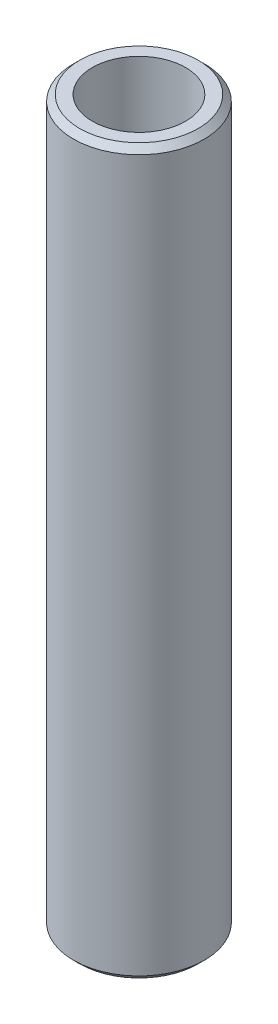
ISO-10303-21;
HEADER;
FILE_DESCRIPTION(('STEP AP214'),'2;1');
FILE_NAME('part.step','',(''),(''),'','','');
FILE_SCHEMA(('AUTOMOTIVE_DESIGN { 1 0 10303 214 1 1 1 1 }'));
ENDSEC;
DATA;
#1=APPLICATION_CONTEXT('core data for automotive mechanical design processes');
#2=APPLICATION_PROTOCOL_DEFINITION('international standard','automotive_design',2000,#1);
#3=PRODUCT_CONTEXT('',#1,'mechanical');
#4=PRODUCT('Part','Part','',(#3));
#5=PRODUCT_RELATED_PRODUCT_CATEGORY('part','',(#4));
#6=PRODUCT_DEFINITION_FORMATION('','',#4);
#7=PRODUCT_DEFINITION_CONTEXT('part definition',#1,'design');
#8=PRODUCT_DEFINITION('design','',#6,#7);
#9=PRODUCT_DEFINITION_SHAPE('','',#8);
#10=(LENGTH_UNIT() NAMED_UNIT(*) SI_UNIT(.MILLI.,.METRE.));
#11=(NAMED_UNIT(*) PLANE_ANGLE_UNIT() SI_UNIT($,.RADIAN.));
#12=(NAMED_UNIT(*) SI_UNIT($,.STERADIAN.) SOLID_ANGLE_UNIT());
#13=UNCERTAINTY_MEASURE_WITH_UNIT(LENGTH_MEASURE(1.E-05),#10,'distance_accuracy_value','');
#14=(GEOMETRIC_REPRESENTATION_CONTEXT(3) GLOBAL_UNCERTAINTY_ASSIGNED_CONTEXT((#13)) GLOBAL_UNIT_ASSIGNED_CONTEXT((#10,
#11,#12)) REPRESENTATION_CONTEXT('',''));
#15=CARTESIAN_POINT('',(0.,0.,0.));
#16=DIRECTION('',(0.,0.,1.));
#17=DIRECTION('',(1.,0.,0.));
#18=AXIS2_PLACEMENT_3D('',#15,#16,#17);
#19=CARTESIAN_POINT('',(0.,249.069710007552,0.));
#20=DIRECTION('',(0.,-1.,0.));
#21=DIRECTION('',(0.,0.,-1.));
#22=AXIS2_PLACEMENT_3D('',#19,#20,#21);
#23=CYLINDRICAL_SURFACE('',#22,22.5);
#24=CARTESIAN_POINT('',(0.,246.967636733421,0.));
#25=DIRECTION('',(0.,1.,0.));
#26=DIRECTION('',(0.,0.,1.));
#27=AXIS2_PLACEMENT_3D('',#24,#25,#26);
#28=CIRCLE('',#27,22.5);
#29=CARTESIAN_POINT('',(0.,246.967636733421,22.5));
#30=VERTEX_POINT('',#29);
#31=EDGE_CURVE('E50',#30,#30,#28,.F.);
#32=ORIENTED_EDGE('',*,*,#31,.T.);
#33=EDGE_LOOP('',(#32));
#34=FACE_BOUND('',#33,.T.);
#35=CARTESIAN_POINT('',(0.,2.10207327413156,0.));
#36=DIRECTION('',(0.,1.,0.));
#37=DIRECTION('',(0.,0.,1.));
#38=AXIS2_PLACEMENT_3D('',#35,#36,#37);
#39=CIRCLE('',#38,22.5);
#40=CARTESIAN_POINT('',(0.,2.10207327413156,22.5));
#41=VERTEX_POINT('',#40);
#42=EDGE_CURVE('E51',#41,#41,#39,.T.);
#43=ORIENTED_EDGE('',*,*,#42,.T.);
#44=EDGE_LOOP('',(#43));
#45=FACE_BOUND('',#44,.T.);
#46=ADVANCED_FACE('F39',(#34,#45),#23,.T.);
#47=CARTESIAN_POINT('',(0.,249.069710007552,0.));
#48=DIRECTION('',(0.,1.,0.));
#49=DIRECTION('',(0.,0.,1.));
#50=AXIS2_PLACEMENT_3D('',#47,#48,#49);
#51=PLANE('',#50);
#52=CARTESIAN_POINT('',(0.,249.069710007552,0.));
#53=DIRECTION('',(0.,1.,0.));
#54=DIRECTION('',(0.,0.,1.));
#55=AXIS2_PLACEMENT_3D('',#52,#53,#54);
#56=CIRCLE('',#55,20.3979267258684);
#57=CARTESIAN_POINT('',(0.,249.069710007552,20.3979267258684));
#58=VERTEX_POINT('',#57);
#59=EDGE_CURVE('E54',#58,#58,#56,.T.);
#60=ORIENTED_EDGE('',*,*,#59,.T.);
#61=EDGE_LOOP('',(#60));
#62=FACE_BOUND('',#61,.T.);
#63=CARTESIAN_POINT('',(0.,249.069710007552,0.));
#64=DIRECTION('',(0.,1.,0.));
#65=DIRECTION('',(0.,0.,1.));
#66=AXIS2_PLACEMENT_3D('',#63,#64,#65);
#67=CIRCLE('',#66,16.0479055248314);
#68=CARTESIAN_POINT('',(0.,249.069710007552,16.0479055248314));
#69=VERTEX_POINT('',#68);
#70=EDGE_CURVE('E58',#69,#69,#67,.T.);
#71=ORIENTED_EDGE('',*,*,#70,.F.);
#72=EDGE_LOOP('',(#71));
#73=FACE_BOUND('',#72,.T.);
#74=ADVANCED_FACE('F69',(#62,#73),#51,.T.);
#75=CARTESIAN_POINT('',(0.,0.,0.));
#76=DIRECTION('',(0.,1.,0.));
#77=DIRECTION('',(0.,0.,1.));
#78=AXIS2_PLACEMENT_3D('',#75,#76,#77);
#79=PLANE('',#78);
#80=CARTESIAN_POINT('',(0.,0.,0.));
#81=DIRECTION('',(0.,1.,0.));
#82=DIRECTION('',(0.,0.,1.));
#83=AXIS2_PLACEMENT_3D('',#80,#81,#82);
#84=CIRCLE('',#83,20.3979267258684);
#85=CARTESIAN_POINT('',(0.,0.,20.3979267258684));
#86=VERTEX_POINT('',#85);
#87=EDGE_CURVE('E10',#86,#86,#84,.F.);
#88=ORIENTED_EDGE('',*,*,#87,.T.);
#89=EDGE_LOOP('',(#88));
#90=FACE_BOUND('',#89,.T.);
#91=CARTESIAN_POINT('',(0.,0.,0.));
#92=DIRECTION('',(0.,1.,0.));
#93=DIRECTION('',(0.,0.,1.));
#94=AXIS2_PLACEMENT_3D('',#91,#92,#93);
#95=CIRCLE('',#94,16.0479055248314);
#96=CARTESIAN_POINT('',(0.,0.,16.0479055248314));
#97=VERTEX_POINT('',#96);
#98=EDGE_CURVE('E63',#97,#97,#95,.T.);
#99=ORIENTED_EDGE('',*,*,#98,.T.);
#100=EDGE_LOOP('',(#99));
#101=FACE_BOUND('',#100,.T.);
#102=ADVANCED_FACE('F75',(#90,#101),#79,.F.);
#103=CARTESIAN_POINT('',(0.,249.069710007552,0.));
#104=DIRECTION('',(0.,-1.,0.));
#105=DIRECTION('',(0.,0.,-1.));
#106=AXIS2_PLACEMENT_3D('',#103,#104,#105);
#107=CYLINDRICAL_SURFACE('',#106,16.0479055248314);
#108=ORIENTED_EDGE('',*,*,#70,.T.);
#109=EDGE_LOOP('',(#108));
#110=FACE_BOUND('',#109,.T.);
#111=ORIENTED_EDGE('',*,*,#98,.F.);
#112=EDGE_LOOP('',(#111));
#113=FACE_BOUND('',#112,.T.);
#114=ADVANCED_FACE('F70',(#110,#113),#107,.F.);
#115=CARTESIAN_POINT('',(0.,249.069710007552,0.));
#116=DIRECTION('',(0.,-1.,0.));
#117=DIRECTION('',(0.,0.,-1.));
#118=AXIS2_PLACEMENT_3D('',#115,#116,#117);
#119=CONICAL_SURFACE('',#118,20.3979267258684,0.785398163397444);
#120=ORIENTED_EDGE('',*,*,#31,.F.);
#121=EDGE_LOOP('',(#120));
#122=FACE_BOUND('',#121,.T.);
#123=ORIENTED_EDGE('',*,*,#59,.F.);
#124=EDGE_LOOP('',(#123));
#125=FACE_BOUND('',#124,.T.);
#126=ADVANCED_FACE('F81',(#122,#125),#119,.T.);
#127=CARTESIAN_POINT('',(0.,2.10207327413156,0.));
#128=DIRECTION('',(0.,1.,0.));
#129=DIRECTION('',(0.,0.,1.));
#130=AXIS2_PLACEMENT_3D('',#127,#128,#129);
#131=CONICAL_SURFACE('',#130,22.5,0.785398163397452);
#132=ORIENTED_EDGE('',*,*,#87,.F.);
#133=EDGE_LOOP('',(#132));
#134=FACE_BOUND('',#133,.T.);
#135=ORIENTED_EDGE('',*,*,#42,.F.);
#136=EDGE_LOOP('',(#135));
#137=FACE_BOUND('',#136,.T.);
#138=ADVANCED_FACE('F45',(#134,#137),#131,.T.);
#139=CLOSED_SHELL('',(#46,#74,#102,#114,#126,#138));
#140=MANIFOLD_SOLID_BREP('B2',#139);
#141=ADVANCED_BREP_SHAPE_REPRESENTATION('',(#18,#140),#14);
#142=SHAPE_DEFINITION_REPRESENTATION(#9,#141);
ENDSEC;
END-ISO-10303-21;
